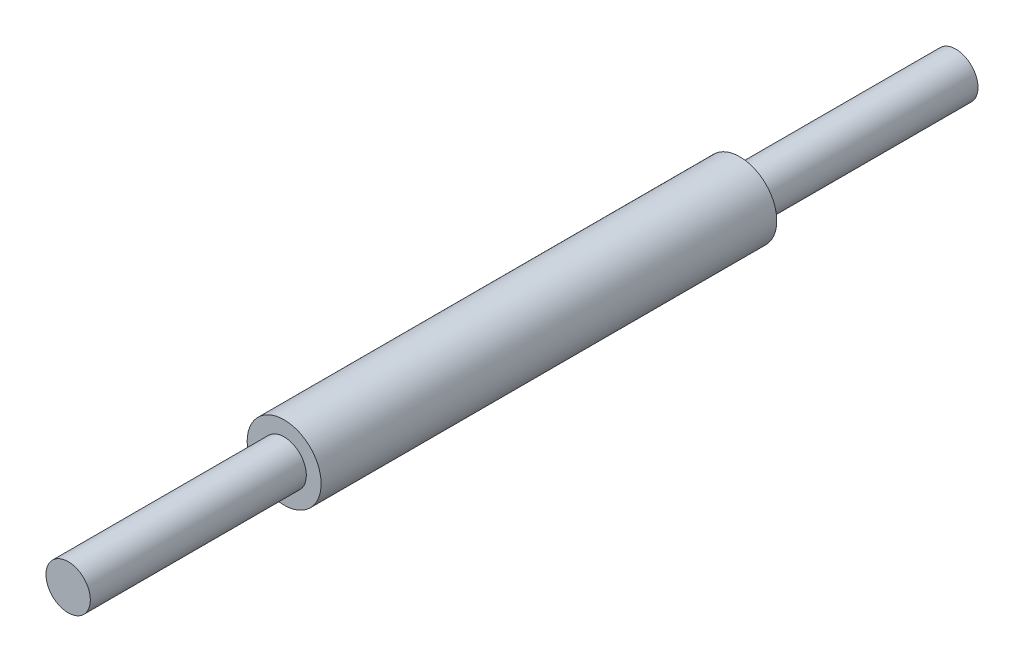
ISO-10303-21;
HEADER;
FILE_DESCRIPTION(('STEP AP214'),'2;1');
FILE_NAME('part.step','',(''),(''),'','','');
FILE_SCHEMA(('AUTOMOTIVE_DESIGN { 1 0 10303 214 1 1 1 1 }'));
ENDSEC;
DATA;
#1=APPLICATION_CONTEXT('core data for automotive mechanical design processes');
#2=APPLICATION_PROTOCOL_DEFINITION('international standard','automotive_design',2000,#1);
#3=PRODUCT_CONTEXT('',#1,'mechanical');
#4=PRODUCT('Part','Part','',(#3));
#5=PRODUCT_RELATED_PRODUCT_CATEGORY('part','',(#4));
#6=PRODUCT_DEFINITION_FORMATION('','',#4);
#7=PRODUCT_DEFINITION_CONTEXT('part definition',#1,'design');
#8=PRODUCT_DEFINITION('design','',#6,#7);
#9=PRODUCT_DEFINITION_SHAPE('','',#8);
#10=(LENGTH_UNIT() NAMED_UNIT(*) SI_UNIT(.MILLI.,.METRE.));
#11=(NAMED_UNIT(*) PLANE_ANGLE_UNIT() SI_UNIT($,.RADIAN.));
#12=(NAMED_UNIT(*) SI_UNIT($,.STERADIAN.) SOLID_ANGLE_UNIT());
#13=UNCERTAINTY_MEASURE_WITH_UNIT(LENGTH_MEASURE(1.E-05),#10,'distance_accuracy_value','');
#14=(GEOMETRIC_REPRESENTATION_CONTEXT(3) GLOBAL_UNCERTAINTY_ASSIGNED_CONTEXT((#13)) GLOBAL_UNIT_ASSIGNED_CONTEXT((#10,
#11,#12)) REPRESENTATION_CONTEXT('',''));
#15=CARTESIAN_POINT('',(0.,0.,0.));
#16=DIRECTION('',(0.,0.,1.));
#17=DIRECTION('',(1.,0.,0.));
#18=AXIS2_PLACEMENT_3D('',#15,#16,#17);
#19=CARTESIAN_POINT('',(0.,0.,15.4));
#20=DIRECTION('',(0.,0.,-1.));
#21=DIRECTION('',(-1.,0.,0.));
#22=AXIS2_PLACEMENT_3D('',#19,#20,#21);
#23=CYLINDRICAL_SURFACE('',#22,2.5);
#24=CARTESIAN_POINT('',(0.,0.,15.4));
#25=DIRECTION('',(0.,0.,1.));
#26=DIRECTION('',(1.,0.,0.));
#27=AXIS2_PLACEMENT_3D('',#24,#25,#26);
#28=CIRCLE('',#27,2.5);
#29=CARTESIAN_POINT('',(-2.5,0.,15.4));
#30=VERTEX_POINT('',#29);
#31=EDGE_CURVE('E41',#30,#30,#28,.T.);
#32=CARTESIAN_POINT('',(0.,0.,-15.4));
#33=DIRECTION('',(0.,0.,1.));
#34=DIRECTION('',(1.,0.,0.));
#35=AXIS2_PLACEMENT_3D('',#32,#33,#34);
#36=CIRCLE('',#35,2.5);
#37=CARTESIAN_POINT('',(-2.5,0.,-15.4));
#38=VERTEX_POINT('',#37);
#39=EDGE_CURVE('E45',#38,#38,#36,.T.);
#40=CARTESIAN_POINT('',(-2.5,0.,15.4));
#41=CARTESIAN_POINT('',(-2.5,0.,15.0791666666667));
#42=CARTESIAN_POINT('',(-2.5,0.,14.7583333333333));
#43=CARTESIAN_POINT('',(-2.5,0.,14.1166666666667));
#44=CARTESIAN_POINT('',(-2.5,0.,13.7958333333333));
#45=CARTESIAN_POINT('',(-2.5,0.,13.1541666666667));
#46=CARTESIAN_POINT('',(-2.5,0.,12.8333333333333));
#47=CARTESIAN_POINT('',(-2.5,0.,12.1916666666667));
#48=CARTESIAN_POINT('',(-2.5,0.,11.8708333333333));
#49=CARTESIAN_POINT('',(-2.5,0.,11.2291666666667));
#50=CARTESIAN_POINT('',(-2.5,0.,10.9083333333333));
#51=CARTESIAN_POINT('',(-2.5,0.,10.2666666666667));
#52=CARTESIAN_POINT('',(-2.5,0.,9.94583333333333));
#53=CARTESIAN_POINT('',(-2.5,0.,9.30416666666667));
#54=CARTESIAN_POINT('',(-2.5,0.,8.98333333333333));
#55=CARTESIAN_POINT('',(-2.5,0.,8.34166666666667));
#56=CARTESIAN_POINT('',(-2.5,0.,8.02083333333333));
#57=CARTESIAN_POINT('',(-2.5,0.,7.37916666666667));
#58=CARTESIAN_POINT('',(-2.5,0.,7.05833333333333));
#59=CARTESIAN_POINT('',(-2.5,0.,6.41666666666667));
#60=CARTESIAN_POINT('',(-2.5,0.,6.09583333333333));
#61=CARTESIAN_POINT('',(-2.5,0.,5.45416666666667));
#62=CARTESIAN_POINT('',(-2.5,0.,5.13333333333333));
#63=CARTESIAN_POINT('',(-2.5,0.,4.49166666666667));
#64=CARTESIAN_POINT('',(-2.5,0.,4.17083333333333));
#65=CARTESIAN_POINT('',(-2.5,0.,3.52916666666667));
#66=CARTESIAN_POINT('',(-2.5,0.,3.20833333333333));
#67=CARTESIAN_POINT('',(-2.5,0.,2.56666666666667));
#68=CARTESIAN_POINT('',(-2.5,0.,2.24583333333333));
#69=CARTESIAN_POINT('',(-2.5,0.,1.60416666666666));
#70=CARTESIAN_POINT('',(-2.5,0.,1.28333333333333));
#71=CARTESIAN_POINT('',(-2.5,0.,0.641666666666665));
#72=CARTESIAN_POINT('',(-2.5,0.,0.320833333333332));
#73=CARTESIAN_POINT('',(-2.5,0.,-0.320833333333335));
#74=CARTESIAN_POINT('',(-2.5,0.,-0.641666666666668));
#75=CARTESIAN_POINT('',(-2.5,0.,-1.28333333333333));
#76=CARTESIAN_POINT('',(-2.5,0.,-1.60416666666667));
#77=CARTESIAN_POINT('',(-2.5,0.,-2.24583333333333));
#78=CARTESIAN_POINT('',(-2.5,0.,-2.56666666666667));
#79=CARTESIAN_POINT('',(-2.5,0.,-3.20833333333333));
#80=CARTESIAN_POINT('',(-2.5,0.,-3.52916666666667));
#81=CARTESIAN_POINT('',(-2.5,0.,-4.17083333333333));
#82=CARTESIAN_POINT('',(-2.5,0.,-4.49166666666667));
#83=CARTESIAN_POINT('',(-2.5,0.,-5.13333333333333));
#84=CARTESIAN_POINT('',(-2.5,0.,-5.45416666666667));
#85=CARTESIAN_POINT('',(-2.5,0.,-6.09583333333333));
#86=CARTESIAN_POINT('',(-2.5,0.,-6.41666666666667));
#87=CARTESIAN_POINT('',(-2.5,0.,-7.05833333333333));
#88=CARTESIAN_POINT('',(-2.5,0.,-7.37916666666667));
#89=CARTESIAN_POINT('',(-2.5,0.,-8.02083333333334));
#90=CARTESIAN_POINT('',(-2.5,0.,-8.34166666666667));
#91=CARTESIAN_POINT('',(-2.5,0.,-8.98333333333334));
#92=CARTESIAN_POINT('',(-2.5,0.,-9.30416666666667));
#93=CARTESIAN_POINT('',(-2.5,0.,-9.94583333333334));
#94=CARTESIAN_POINT('',(-2.5,0.,-10.2666666666667));
#95=CARTESIAN_POINT('',(-2.5,0.,-10.9083333333333));
#96=CARTESIAN_POINT('',(-2.5,0.,-11.2291666666667));
#97=CARTESIAN_POINT('',(-2.5,0.,-11.8708333333333));
#98=CARTESIAN_POINT('',(-2.5,0.,-12.1916666666667));
#99=CARTESIAN_POINT('',(-2.5,0.,-12.8333333333333));
#100=CARTESIAN_POINT('',(-2.5,0.,-13.1541666666667));
#101=CARTESIAN_POINT('',(-2.5,0.,-13.7958333333333));
#102=CARTESIAN_POINT('',(-2.5,0.,-14.1166666666667));
#103=CARTESIAN_POINT('',(-2.5,0.,-14.7583333333333));
#104=CARTESIAN_POINT('',(-2.5,0.,-15.0791666666667));
#105=CARTESIAN_POINT('',(-2.5,0.,-15.4));
#106=B_SPLINE_CURVE_WITH_KNOTS('',3,(#40,#41,#42,#43,#44,#45,#46,#47,#48,#49,#50,#51,#52,#53,
#54,#55,#56,#57,#58,#59,#60,#61,#62,#63,#64,#65,#66,#67,#68,#69,#70,#71,#72,#73,#74,#75,#76,#77,
#78,#79,#80,#81,#82,#83,#84,#85,#86,#87,#88,#89,#90,#91,#92,#93,#94,#95,#96,#97,#98,#99,#100,
#101,#102,#103,#104,#105),.UNSPECIFIED.,.F.,.F.,(4,2,2,2,2,2,2,2,2,2,2,2,2,2,2,2,2,2,2,2,2,2,2,
2,2,2,2,2,2,2,2,2,4),(0.,0.962500000000002,1.925,2.8875,3.85,4.8125,5.775,6.7375,7.7,8.6625,
9.625,10.5875,11.55,12.5125,13.475,14.4375,15.4,16.3625,17.325,18.2875,19.25,20.2125,21.175,
22.1375,23.1,24.0625,25.025,25.9875,26.95,27.9125,28.875,29.8375,30.8),.UNSPECIFIED.);
#107=EDGE_CURVE('BSEAM35',#30,#38,#106,.T.);
#108=ORIENTED_EDGE('',*,*,#31,.F.);
#109=ORIENTED_EDGE('',*,*,#39,.T.);
#110=ORIENTED_EDGE('',*,*,#107,.T.);
#111=ORIENTED_EDGE('',*,*,#107,.F.);
#112=EDGE_LOOP('',(#108,#110,#109,#111));
#113=FACE_BOUND('',#112,.T.);
#114=ADVANCED_FACE('F35',(#113),#23,.T.);
#115=CARTESIAN_POINT('',(0.,0.,15.4));
#116=DIRECTION('',(0.,0.,1.));
#117=DIRECTION('',(1.,0.,0.));
#118=AXIS2_PLACEMENT_3D('',#115,#116,#117);
#119=PLANE('',#118);
#120=CARTESIAN_POINT('',(0.,0.,15.4));
#121=DIRECTION('',(0.,0.,1.));
#122=DIRECTION('',(1.,0.,0.));
#123=AXIS2_PLACEMENT_3D('',#120,#121,#122);
#124=CIRCLE('',#123,1.5);
#125=CARTESIAN_POINT('',(1.5,0.,15.4));
#126=VERTEX_POINT('',#125);
#127=EDGE_CURVE('E50',#126,#126,#124,.F.);
#128=ORIENTED_EDGE('',*,*,#127,.T.);
#129=EDGE_LOOP('',(#128));
#130=FACE_BOUND('',#129,.T.);
#131=ORIENTED_EDGE('',*,*,#31,.T.);
#132=EDGE_LOOP('',(#131));
#133=FACE_BOUND('',#132,.T.);
#134=ADVANCED_FACE('F79',(#130,#133),#119,.T.);
#135=CARTESIAN_POINT('',(0.,0.,-15.4));
#136=DIRECTION('',(0.,0.,1.));
#137=DIRECTION('',(1.,0.,0.));
#138=AXIS2_PLACEMENT_3D('',#135,#136,#137);
#139=PLANE('',#138);
#140=CARTESIAN_POINT('',(0.,0.,-15.4));
#141=DIRECTION('',(0.,0.,1.));
#142=DIRECTION('',(1.,0.,0.));
#143=AXIS2_PLACEMENT_3D('',#140,#141,#142);
#144=CIRCLE('',#143,1.5);
#145=CARTESIAN_POINT('',(1.5,0.,-15.4));
#146=VERTEX_POINT('',#145);
#147=EDGE_CURVE('E10',#146,#146,#144,.F.);
#148=ORIENTED_EDGE('',*,*,#147,.F.);
#149=EDGE_LOOP('',(#148));
#150=FACE_BOUND('',#149,.T.);
#151=ORIENTED_EDGE('',*,*,#39,.F.);
#152=EDGE_LOOP('',(#151));
#153=FACE_BOUND('',#152,.T.);
#154=ADVANCED_FACE('F84',(#150,#153),#139,.F.);
#155=CARTESIAN_POINT('',(0.,0.,-30.));
#156=DIRECTION('',(0.,0.,1.));
#157=DIRECTION('',(1.,0.,0.));
#158=AXIS2_PLACEMENT_3D('',#155,#156,#157);
#159=PLANE('',#158);
#160=CARTESIAN_POINT('',(0.,0.,-30.));
#161=DIRECTION('',(0.,0.,1.));
#162=DIRECTION('',(1.,0.,0.));
#163=AXIS2_PLACEMENT_3D('',#160,#161,#162);
#164=CIRCLE('',#163,1.5);
#165=CARTESIAN_POINT('',(1.5,0.,-30.));
#166=VERTEX_POINT('',#165);
#167=EDGE_CURVE('E55',#166,#166,#164,.T.);
#168=ORIENTED_EDGE('',*,*,#167,.F.);
#169=EDGE_LOOP('',(#168));
#170=FACE_BOUND('',#169,.T.);
#171=ADVANCED_FACE('F73',(#170),#159,.F.);
#172=CARTESIAN_POINT('',(0.,0.,30.));
#173=DIRECTION('',(0.,0.,-1.));
#174=DIRECTION('',(-1.,0.,0.));
#175=AXIS2_PLACEMENT_3D('',#172,#173,#174);
#176=CYLINDRICAL_SURFACE('',#175,1.5);
#177=ORIENTED_EDGE('',*,*,#167,.T.);
#178=EDGE_LOOP('',(#177));
#179=FACE_BOUND('',#178,.T.);
#180=ORIENTED_EDGE('',*,*,#147,.T.);
#181=EDGE_LOOP('',(#180));
#182=FACE_BOUND('',#181,.T.);
#183=ADVANCED_FACE('F65',(#179,#182),#176,.T.);
#184=ORIENTED_EDGE('',*,*,#127,.F.);
#185=EDGE_LOOP('',(#184));
#186=FACE_BOUND('',#185,.T.);
#187=CARTESIAN_POINT('',(0.,0.,30.));
#188=DIRECTION('',(0.,0.,1.));
#189=DIRECTION('',(1.,0.,0.));
#190=AXIS2_PLACEMENT_3D('',#187,#188,#189);
#191=CIRCLE('',#190,1.5);
#192=CARTESIAN_POINT('',(1.5,0.,30.));
#193=VERTEX_POINT('',#192);
#194=EDGE_CURVE('E54',#193,#193,#191,.T.);
#195=ORIENTED_EDGE('',*,*,#194,.F.);
#196=EDGE_LOOP('',(#195));
#197=FACE_BOUND('',#196,.T.);
#198=ADVANCED_FACE('F63',(#186,#197),#176,.T.);
#199=CARTESIAN_POINT('',(0.,0.,30.));
#200=DIRECTION('',(0.,0.,1.));
#201=DIRECTION('',(1.,0.,0.));
#202=AXIS2_PLACEMENT_3D('',#199,#200,#201);
#203=PLANE('',#202);
#204=ORIENTED_EDGE('',*,*,#194,.T.);
#205=EDGE_LOOP('',(#204));
#206=FACE_BOUND('',#205,.T.);
#207=ADVANCED_FACE('F61',(#206),#203,.T.);
#208=CLOSED_SHELL('',(#114,#134,#154,#171,#183,#198,#207));
#209=MANIFOLD_SOLID_BREP('B2',#208);
#210=ADVANCED_BREP_SHAPE_REPRESENTATION('',(#18,#209),#14);
#211=SHAPE_DEFINITION_REPRESENTATION(#9,#210);
ENDSEC;
END-ISO-10303-21;
